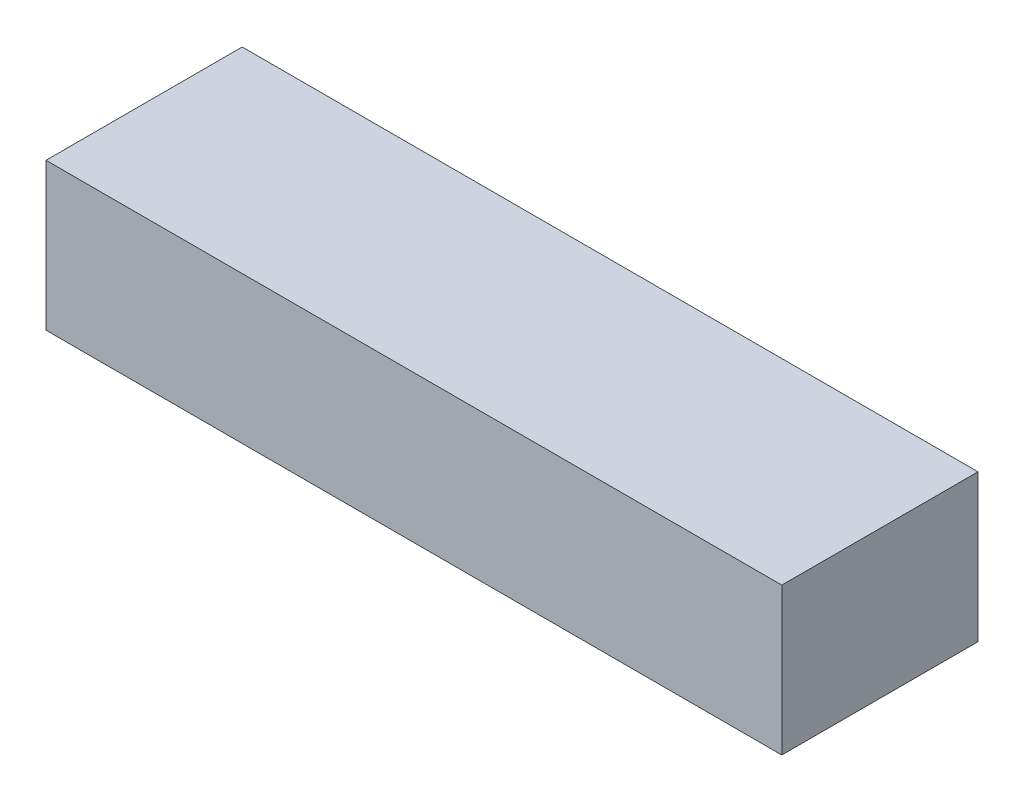
ISO-10303-21;
HEADER;
FILE_DESCRIPTION(('STEP AP214'),'2;1');
FILE_NAME('part.step','',(''),(''),'','','');
FILE_SCHEMA(('AUTOMOTIVE_DESIGN { 1 0 10303 214 1 1 1 1 }'));
ENDSEC;
DATA;
#1=APPLICATION_CONTEXT('core data for automotive mechanical design processes');
#2=APPLICATION_PROTOCOL_DEFINITION('international standard','automotive_design',2000,#1);
#3=PRODUCT_CONTEXT('',#1,'mechanical');
#4=PRODUCT('Part','Part','',(#3));
#5=PRODUCT_RELATED_PRODUCT_CATEGORY('part','',(#4));
#6=PRODUCT_DEFINITION_FORMATION('','',#4);
#7=PRODUCT_DEFINITION_CONTEXT('part definition',#1,'design');
#8=PRODUCT_DEFINITION('design','',#6,#7);
#9=PRODUCT_DEFINITION_SHAPE('','',#8);
#10=(LENGTH_UNIT() NAMED_UNIT(*) SI_UNIT(.MILLI.,.METRE.));
#11=(NAMED_UNIT(*) PLANE_ANGLE_UNIT() SI_UNIT($,.RADIAN.));
#12=(NAMED_UNIT(*) SI_UNIT($,.STERADIAN.) SOLID_ANGLE_UNIT());
#13=UNCERTAINTY_MEASURE_WITH_UNIT(LENGTH_MEASURE(1.E-05),#10,'distance_accuracy_value','');
#14=(GEOMETRIC_REPRESENTATION_CONTEXT(3) GLOBAL_UNCERTAINTY_ASSIGNED_CONTEXT((#13)) GLOBAL_UNIT_ASSIGNED_CONTEXT((#10,
#11,#12)) REPRESENTATION_CONTEXT('',''));
#15=CARTESIAN_POINT('',(0.,0.,0.));
#16=DIRECTION('',(0.,0.,1.));
#17=DIRECTION('',(1.,0.,0.));
#18=AXIS2_PLACEMENT_3D('',#15,#16,#17);
#19=CARTESIAN_POINT('',(75.,30.,20.));
#20=DIRECTION('',(-1.,0.,0.));
#21=DIRECTION('',(0.,0.,1.));
#22=AXIS2_PLACEMENT_3D('',#19,#20,#21);
#23=PLANE('',#22);
#24=DIRECTION('',(0.,0.,-1.));
#25=VECTOR('',#24,1.);
#26=CARTESIAN_POINT('',(75.,0.,20.));
#27=LINE('',#26,#25);
#28=CARTESIAN_POINT('',(75.,0.,20.));
#29=VERTEX_POINT('',#28);
#30=CARTESIAN_POINT('',(75.,0.,-20.));
#31=VERTEX_POINT('',#30);
#32=EDGE_CURVE('E96',#29,#31,#27,.T.);
#33=ORIENTED_EDGE('',*,*,#32,.T.);
#34=DIRECTION('',(0.,-1.,0.));
#35=VECTOR('',#34,1.);
#36=CARTESIAN_POINT('',(75.,30.,-20.));
#37=LINE('',#36,#35);
#38=CARTESIAN_POINT('',(75.,30.,-20.));
#39=VERTEX_POINT('',#38);
#40=EDGE_CURVE('E11',#39,#31,#37,.T.);
#41=ORIENTED_EDGE('',*,*,#40,.F.);
#42=DIRECTION('',(0.,0.,-1.));
#43=VECTOR('',#42,1.);
#44=CARTESIAN_POINT('',(75.,30.,20.));
#45=LINE('',#44,#43);
#46=CARTESIAN_POINT('',(75.,30.,20.));
#47=VERTEX_POINT('',#46);
#48=EDGE_CURVE('E84',#47,#39,#45,.T.);
#49=ORIENTED_EDGE('',*,*,#48,.F.);
#50=DIRECTION('',(0.,-1.,0.));
#51=VECTOR('',#50,1.);
#52=CARTESIAN_POINT('',(75.,30.,20.));
#53=LINE('',#52,#51);
#54=EDGE_CURVE('E92',#47,#29,#53,.T.);
#55=ORIENTED_EDGE('',*,*,#54,.T.);
#56=EDGE_LOOP('',(#33,#41,#49,#55));
#57=FACE_BOUND('',#56,.T.);
#58=ADVANCED_FACE('F33',(#57),#23,.F.);
#59=CARTESIAN_POINT('',(-75.,30.,-20.));
#60=DIRECTION('',(0.,0.,1.));
#61=DIRECTION('',(1.,0.,0.));
#62=AXIS2_PLACEMENT_3D('',#59,#60,#61);
#63=PLANE('',#62);
#64=DIRECTION('',(-1.,0.,0.));
#65=VECTOR('',#64,1.);
#66=CARTESIAN_POINT('',(-75.,0.,-20.));
#67=LINE('',#66,#65);
#68=CARTESIAN_POINT('',(-75.,0.,-20.));
#69=VERTEX_POINT('',#68);
#70=EDGE_CURVE('E88',#31,#69,#67,.T.);
#71=ORIENTED_EDGE('',*,*,#70,.T.);
#72=DIRECTION('',(0.,-1.,0.));
#73=VECTOR('',#72,1.);
#74=CARTESIAN_POINT('',(-75.,30.,-20.));
#75=LINE('',#74,#73);
#76=CARTESIAN_POINT('',(-75.,30.,-20.));
#77=VERTEX_POINT('',#76);
#78=EDGE_CURVE('E41',#77,#69,#75,.T.);
#79=ORIENTED_EDGE('',*,*,#78,.F.);
#80=DIRECTION('',(-1.,0.,0.));
#81=VECTOR('',#80,1.);
#82=CARTESIAN_POINT('',(-75.,30.,-20.));
#83=LINE('',#82,#81);
#84=EDGE_CURVE('E79',#39,#77,#83,.T.);
#85=ORIENTED_EDGE('',*,*,#84,.F.);
#86=ORIENTED_EDGE('',*,*,#40,.T.);
#87=EDGE_LOOP('',(#71,#79,#85,#86));
#88=FACE_BOUND('',#87,.T.);
#89=ADVANCED_FACE('F87',(#88),#63,.F.);
#90=CARTESIAN_POINT('',(-75.,30.,20.));
#91=DIRECTION('',(1.,0.,0.));
#92=DIRECTION('',(0.,0.,-1.));
#93=AXIS2_PLACEMENT_3D('',#90,#91,#92);
#94=PLANE('',#93);
#95=DIRECTION('',(0.,0.,1.));
#96=VECTOR('',#95,1.);
#97=CARTESIAN_POINT('',(-75.,0.,20.));
#98=LINE('',#97,#96);
#99=CARTESIAN_POINT('',(-75.,0.,20.));
#100=VERTEX_POINT('',#99);
#101=EDGE_CURVE('E66',#69,#100,#98,.T.);
#102=ORIENTED_EDGE('',*,*,#101,.T.);
#103=DIRECTION('',(0.,-1.,0.));
#104=VECTOR('',#103,1.);
#105=CARTESIAN_POINT('',(-75.,30.,20.));
#106=LINE('',#105,#104);
#107=CARTESIAN_POINT('',(-75.,30.,20.));
#108=VERTEX_POINT('',#107);
#109=EDGE_CURVE('E89',#108,#100,#106,.T.);
#110=ORIENTED_EDGE('',*,*,#109,.F.);
#111=DIRECTION('',(0.,0.,1.));
#112=VECTOR('',#111,1.);
#113=CARTESIAN_POINT('',(-75.,30.,20.));
#114=LINE('',#113,#112);
#115=EDGE_CURVE('E82',#77,#108,#114,.T.);
#116=ORIENTED_EDGE('',*,*,#115,.F.);
#117=ORIENTED_EDGE('',*,*,#78,.T.);
#118=EDGE_LOOP('',(#102,#110,#116,#117));
#119=FACE_BOUND('',#118,.T.);
#120=ADVANCED_FACE('F90',(#119),#94,.F.);
#121=CARTESIAN_POINT('',(-75.,30.,20.));
#122=DIRECTION('',(0.,0.,-1.));
#123=DIRECTION('',(-1.,0.,0.));
#124=AXIS2_PLACEMENT_3D('',#121,#122,#123);
#125=PLANE('',#124);
#126=DIRECTION('',(1.,0.,0.));
#127=VECTOR('',#126,1.);
#128=CARTESIAN_POINT('',(-75.,0.,20.));
#129=LINE('',#128,#127);
#130=EDGE_CURVE('E72',#100,#29,#129,.T.);
#131=ORIENTED_EDGE('',*,*,#130,.T.);
#132=ORIENTED_EDGE('',*,*,#54,.F.);
#133=DIRECTION('',(1.,0.,0.));
#134=VECTOR('',#133,1.);
#135=CARTESIAN_POINT('',(-75.,30.,20.));
#136=LINE('',#135,#134);
#137=EDGE_CURVE('E49',#108,#47,#136,.T.);
#138=ORIENTED_EDGE('',*,*,#137,.F.);
#139=ORIENTED_EDGE('',*,*,#109,.T.);
#140=EDGE_LOOP('',(#131,#132,#138,#139));
#141=FACE_BOUND('',#140,.T.);
#142=ADVANCED_FACE('F103',(#141),#125,.F.);
#143=CARTESIAN_POINT('',(0.,30.,0.));
#144=DIRECTION('',(0.,-1.,0.));
#145=DIRECTION('',(0.,0.,-1.));
#146=AXIS2_PLACEMENT_3D('',#143,#144,#145);
#147=PLANE('',#146);
#148=ORIENTED_EDGE('',*,*,#48,.T.);
#149=ORIENTED_EDGE('',*,*,#84,.T.);
#150=ORIENTED_EDGE('',*,*,#115,.T.);
#151=ORIENTED_EDGE('',*,*,#137,.T.);
#152=EDGE_LOOP('',(#148,#149,#150,#151));
#153=FACE_BOUND('',#152,.T.);
#154=ADVANCED_FACE('F80',(#153),#147,.F.);
#155=CARTESIAN_POINT('',(0.,0.,0.));
#156=DIRECTION('',(0.,-1.,0.));
#157=DIRECTION('',(0.,0.,-1.));
#158=AXIS2_PLACEMENT_3D('',#155,#156,#157);
#159=PLANE('',#158);
#160=ORIENTED_EDGE('',*,*,#32,.F.);
#161=ORIENTED_EDGE('',*,*,#130,.F.);
#162=ORIENTED_EDGE('',*,*,#101,.F.);
#163=ORIENTED_EDGE('',*,*,#70,.F.);
#164=EDGE_LOOP('',(#160,#161,#162,#163));
#165=FACE_BOUND('',#164,.T.);
#166=ADVANCED_FACE('F106',(#165),#159,.T.);
#167=CLOSED_SHELL('',(#58,#89,#120,#142,#154,#166));
#168=MANIFOLD_SOLID_BREP('B2',#167);
#169=ADVANCED_BREP_SHAPE_REPRESENTATION('',(#18,#168),#14);
#170=SHAPE_DEFINITION_REPRESENTATION(#9,#169);
ENDSEC;
END-ISO-10303-21;
